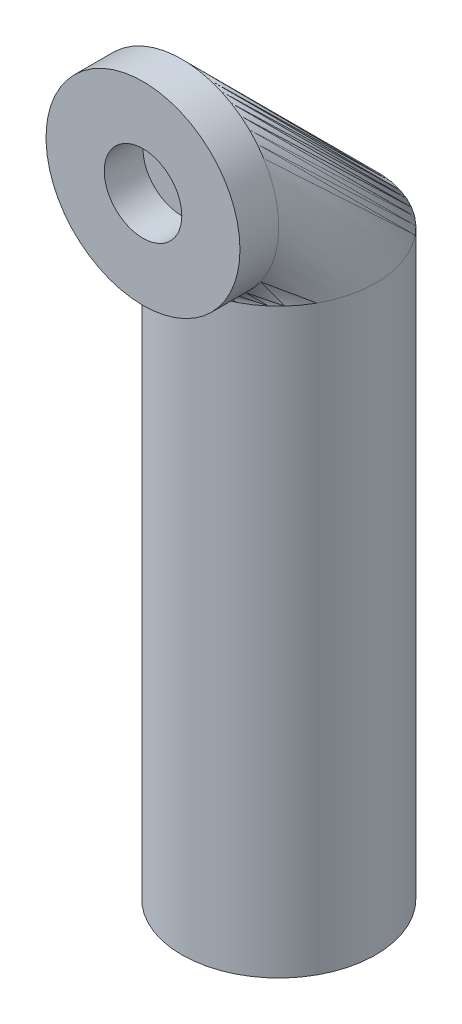
ISO-10303-21;
HEADER;
FILE_DESCRIPTION(('STEP AP214'),'2;1');
FILE_NAME('part.step','',(''),(''),'','','');
FILE_SCHEMA(('AUTOMOTIVE_DESIGN { 1 0 10303 214 1 1 1 1 }'));
ENDSEC;
DATA;
#1=APPLICATION_CONTEXT('core data for automotive mechanical design processes');
#2=APPLICATION_PROTOCOL_DEFINITION('international standard','automotive_design',2000,#1);
#3=PRODUCT_CONTEXT('',#1,'mechanical');
#4=PRODUCT('Part','Part','',(#3));
#5=PRODUCT_RELATED_PRODUCT_CATEGORY('part','',(#4));
#6=PRODUCT_DEFINITION_FORMATION('','',#4);
#7=PRODUCT_DEFINITION_CONTEXT('part definition',#1,'design');
#8=PRODUCT_DEFINITION('design','',#6,#7);
#9=PRODUCT_DEFINITION_SHAPE('','',#8);
#10=(LENGTH_UNIT() NAMED_UNIT(*) SI_UNIT(.MILLI.,.METRE.));
#11=(NAMED_UNIT(*) PLANE_ANGLE_UNIT() SI_UNIT($,.RADIAN.));
#12=(NAMED_UNIT(*) SI_UNIT($,.STERADIAN.) SOLID_ANGLE_UNIT());
#13=UNCERTAINTY_MEASURE_WITH_UNIT(LENGTH_MEASURE(1.E-05),#10,'distance_accuracy_value','');
#14=(GEOMETRIC_REPRESENTATION_CONTEXT(3) GLOBAL_UNCERTAINTY_ASSIGNED_CONTEXT((#13)) GLOBAL_UNIT_ASSIGNED_CONTEXT((#10,
#11,#12)) REPRESENTATION_CONTEXT('',''));
#15=CARTESIAN_POINT('',(0.,0.,0.));
#16=DIRECTION('',(0.,0.,1.));
#17=DIRECTION('',(1.,0.,0.));
#18=AXIS2_PLACEMENT_3D('',#15,#16,#17);
#19=CARTESIAN_POINT('',(0.,300.,0.));
#20=DIRECTION('',(0.,-1.,0.));
#21=DIRECTION('',(0.,0.,-1.));
#22=AXIS2_PLACEMENT_3D('',#19,#20,#21);
#23=CYLINDRICAL_SURFACE('',#22,50.);
#24=CARTESIAN_POINT('',(0.,300.,0.));
#25=DIRECTION('',(0.,1.,0.));
#26=DIRECTION('',(0.,0.,1.));
#27=AXIS2_PLACEMENT_3D('',#24,#25,#26);
#28=CIRCLE('',#27,50.);
#29=CARTESIAN_POINT('',(0.,300.,50.));
#30=VERTEX_POINT('',#29);
#31=EDGE_CURVE('E11',#30,#30,#28,.T.);
#32=ORIENTED_EDGE('',*,*,#31,.F.);
#33=EDGE_LOOP('',(#32));
#34=FACE_BOUND('',#33,.T.);
#35=CARTESIAN_POINT('',(0.,0.,0.));
#36=DIRECTION('',(0.,1.,0.));
#37=DIRECTION('',(0.,0.,1.));
#38=AXIS2_PLACEMENT_3D('',#35,#36,#37);
#39=CIRCLE('',#38,50.);
#40=CARTESIAN_POINT('',(0.,0.,50.));
#41=VERTEX_POINT('',#40);
#42=EDGE_CURVE('E42',#41,#41,#39,.T.);
#43=ORIENTED_EDGE('',*,*,#42,.T.);
#44=EDGE_LOOP('',(#43));
#45=FACE_BOUND('',#44,.T.);
#46=ADVANCED_FACE('F35',(#34,#45),#23,.T.);
#47=CARTESIAN_POINT('',(0.,0.,0.));
#48=DIRECTION('',(0.,1.,0.));
#49=DIRECTION('',(0.,0.,1.));
#50=AXIS2_PLACEMENT_3D('',#47,#48,#49);
#51=PLANE('',#50);
#52=CARTESIAN_POINT('',(0.,0.,0.));
#53=DIRECTION('',(0.,-1.,0.));
#54=DIRECTION('',(0.,0.,-1.));
#55=AXIS2_PLACEMENT_3D('',#52,#53,#54);
#56=CIRCLE('',#55,20.);
#57=CARTESIAN_POINT('',(0.,0.,-20.));
#58=VERTEX_POINT('',#57);
#59=EDGE_CURVE('E73',#58,#58,#56,.T.);
#60=ORIENTED_EDGE('',*,*,#59,.F.);
#61=EDGE_LOOP('',(#60));
#62=FACE_BOUND('',#61,.T.);
#63=ORIENTED_EDGE('',*,*,#42,.F.);
#64=EDGE_LOOP('',(#63));
#65=FACE_BOUND('',#64,.T.);
#66=ADVANCED_FACE('F56',(#62,#65),#51,.F.);
#67=CARTESIAN_POINT('',(0.,300.,50.));
#68=DIRECTION('',(1.,0.,0.));
#69=DIRECTION('',(0.,0.,-1.));
#70=AXIS2_PLACEMENT_3D('',#67,#68,#69);
#71=DEGENERATE_TOROIDAL_SURFACE('',#70,50.,50.,.T.);
#72=CARTESIAN_POINT('',(0.,350.,50.));
#73=DIRECTION('',(0.,0.,1.));
#74=DIRECTION('',(0.,-1.,0.));
#75=AXIS2_PLACEMENT_3D('',#72,#73,#74);
#76=CIRCLE('',#75,50.);
#77=EDGE_CURVE('E47',#30,#30,#76,.T.);
#78=ORIENTED_EDGE('',*,*,#77,.F.);
#79=ORIENTED_EDGE('',*,*,#31,.T.);
#80=EDGE_LOOP('',(#78,#79));
#81=FACE_BOUND('',#80,.T.);
#82=ADVANCED_FACE('F52',(#81),#71,.T.);
#83=CARTESIAN_POINT('',(0.,350.,70.));
#84=DIRECTION('',(0.,0.,-1.));
#85=DIRECTION('',(-1.,0.,0.));
#86=AXIS2_PLACEMENT_3D('',#83,#84,#85);
#87=CYLINDRICAL_SURFACE('',#86,50.);
#88=CARTESIAN_POINT('',(0.,350.,70.));
#89=DIRECTION('',(0.,0.,1.));
#90=DIRECTION('',(1.,0.,0.));
#91=AXIS2_PLACEMENT_3D('',#88,#89,#90);
#92=CIRCLE('',#91,50.);
#93=CARTESIAN_POINT('',(50.,350.,70.));
#94=VERTEX_POINT('',#93);
#95=EDGE_CURVE('E51',#94,#94,#92,.T.);
#96=ORIENTED_EDGE('',*,*,#95,.F.);
#97=EDGE_LOOP('',(#96));
#98=FACE_BOUND('',#97,.T.);
#99=ORIENTED_EDGE('',*,*,#77,.T.);
#100=EDGE_LOOP('',(#99));
#101=FACE_BOUND('',#100,.T.);
#102=ADVANCED_FACE('F48',(#98,#101),#87,.T.);
#103=CARTESIAN_POINT('',(0.,350.,70.));
#104=DIRECTION('',(0.,0.,1.));
#105=DIRECTION('',(1.,0.,0.));
#106=AXIS2_PLACEMENT_3D('',#103,#104,#105);
#107=PLANE('',#106);
#108=CARTESIAN_POINT('',(0.,350.,70.));
#109=DIRECTION('',(0.,0.,1.));
#110=DIRECTION('',(1.,0.,0.));
#111=AXIS2_PLACEMENT_3D('',#108,#109,#110);
#112=CIRCLE('',#111,20.);
#113=CARTESIAN_POINT('',(20.,350.,70.));
#114=VERTEX_POINT('',#113);
#115=EDGE_CURVE('E67',#114,#114,#112,.T.);
#116=ORIENTED_EDGE('',*,*,#115,.F.);
#117=EDGE_LOOP('',(#116));
#118=FACE_BOUND('',#117,.T.);
#119=ORIENTED_EDGE('',*,*,#95,.T.);
#120=EDGE_LOOP('',(#119));
#121=FACE_BOUND('',#120,.T.);
#122=ADVANCED_FACE('F98',(#118,#121),#107,.T.);
#123=CARTESIAN_POINT('',(0.,350.,50.));
#124=DIRECTION('',(0.,0.,1.));
#125=DIRECTION('',(1.,0.,0.));
#126=AXIS2_PLACEMENT_3D('',#123,#124,#125);
#127=CYLINDRICAL_SURFACE('',#126,20.);
#128=CARTESIAN_POINT('',(0.,350.,50.));
#129=DIRECTION('',(0.,0.,1.));
#130=DIRECTION('',(1.,0.,0.));
#131=AXIS2_PLACEMENT_3D('',#128,#129,#130);
#132=CIRCLE('',#131,20.);
#133=CARTESIAN_POINT('',(20.,350.,50.));
#134=VERTEX_POINT('',#133);
#135=EDGE_CURVE('E66',#134,#134,#132,.T.);
#136=ORIENTED_EDGE('',*,*,#135,.F.);
#137=EDGE_LOOP('',(#136));
#138=FACE_BOUND('',#137,.T.);
#139=ORIENTED_EDGE('',*,*,#115,.T.);
#140=EDGE_LOOP('',(#139));
#141=FACE_BOUND('',#140,.T.);
#142=ADVANCED_FACE('F102',(#138,#141),#127,.F.);
#143=CARTESIAN_POINT('',(0.,350.,50.));
#144=DIRECTION('',(0.,0.,1.));
#145=DIRECTION('',(1.,0.,0.));
#146=AXIS2_PLACEMENT_3D('',#143,#144,#145);
#147=PLANE('',#146);
#148=ORIENTED_EDGE('',*,*,#135,.T.);
#149=EDGE_LOOP('',(#148));
#150=FACE_BOUND('',#149,.T.);
#151=ADVANCED_FACE('F84',(#150),#147,.T.);
#152=CARTESIAN_POINT('',(0.,20.,0.));
#153=DIRECTION('',(0.,-1.,0.));
#154=DIRECTION('',(0.,0.,-1.));
#155=AXIS2_PLACEMENT_3D('',#152,#153,#154);
#156=CYLINDRICAL_SURFACE('',#155,20.);
#157=CARTESIAN_POINT('',(0.,20.,0.));
#158=DIRECTION('',(0.,-1.,0.));
#159=DIRECTION('',(0.,0.,-1.));
#160=AXIS2_PLACEMENT_3D('',#157,#158,#159);
#161=CIRCLE('',#160,20.);
#162=CARTESIAN_POINT('',(0.,20.,-20.));
#163=VERTEX_POINT('',#162);
#164=EDGE_CURVE('E70',#163,#163,#161,.T.);
#165=ORIENTED_EDGE('',*,*,#164,.F.);
#166=EDGE_LOOP('',(#165));
#167=FACE_BOUND('',#166,.T.);
#168=ORIENTED_EDGE('',*,*,#59,.T.);
#169=EDGE_LOOP('',(#168));
#170=FACE_BOUND('',#169,.T.);
#171=ADVANCED_FACE('F81',(#167,#170),#156,.F.);
#172=CARTESIAN_POINT('',(0.,20.,0.));
#173=DIRECTION('',(0.,-1.,0.));
#174=DIRECTION('',(0.,0.,-1.));
#175=AXIS2_PLACEMENT_3D('',#172,#173,#174);
#176=PLANE('',#175);
#177=ORIENTED_EDGE('',*,*,#164,.T.);
#178=EDGE_LOOP('',(#177));
#179=FACE_BOUND('',#178,.T.);
#180=ADVANCED_FACE('F79',(#179),#176,.T.);
#181=CLOSED_SHELL('',(#46,#66,#82,#102,#122,#142,#151,#171,#180));
#182=MANIFOLD_SOLID_BREP('B2',#181);
#183=ADVANCED_BREP_SHAPE_REPRESENTATION('',(#18,#182),#14);
#184=SHAPE_DEFINITION_REPRESENTATION(#9,#183);
ENDSEC;
END-ISO-10303-21;
